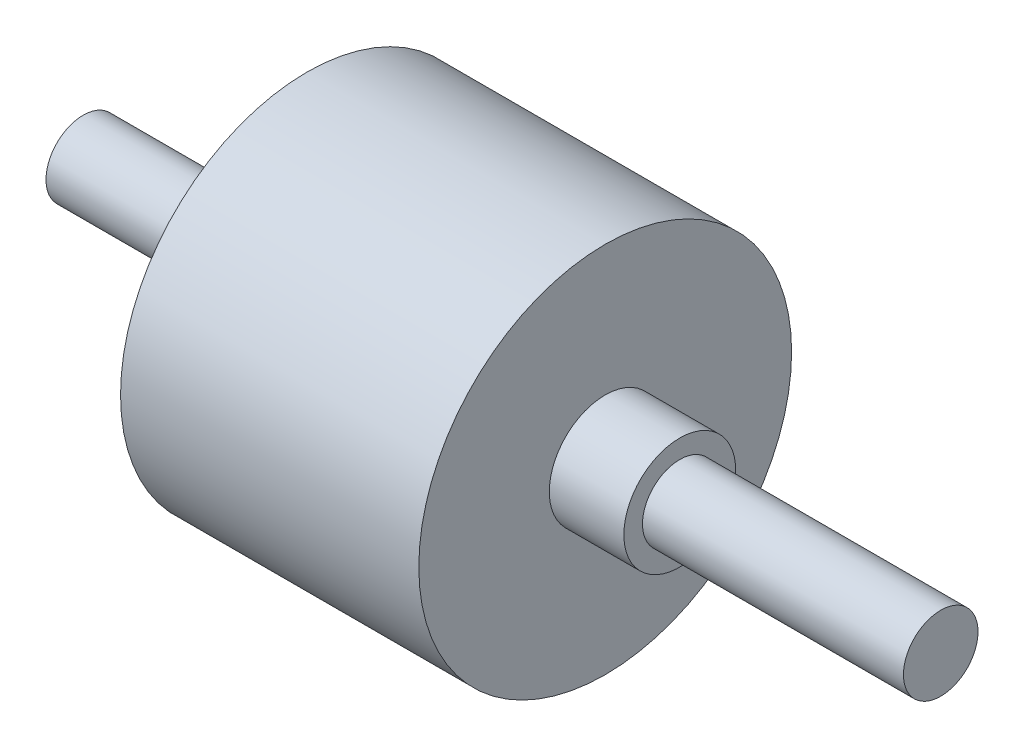
ISO-10303-21;
HEADER;
FILE_DESCRIPTION(('STEP AP214'),'2;1');
FILE_NAME('part.step','',(''),(''),'','','');
FILE_SCHEMA(('AUTOMOTIVE_DESIGN { 1 0 10303 214 1 1 1 1 }'));
ENDSEC;
DATA;
#1=APPLICATION_CONTEXT('core data for automotive mechanical design processes');
#2=APPLICATION_PROTOCOL_DEFINITION('international standard','automotive_design',2000,#1);
#3=PRODUCT_CONTEXT('',#1,'mechanical');
#4=PRODUCT('Part','Part','',(#3));
#5=PRODUCT_RELATED_PRODUCT_CATEGORY('part','',(#4));
#6=PRODUCT_DEFINITION_FORMATION('','',#4);
#7=PRODUCT_DEFINITION_CONTEXT('part definition',#1,'design');
#8=PRODUCT_DEFINITION('design','',#6,#7);
#9=PRODUCT_DEFINITION_SHAPE('','',#8);
#10=(LENGTH_UNIT() NAMED_UNIT(*) SI_UNIT(.MILLI.,.METRE.));
#11=(NAMED_UNIT(*) PLANE_ANGLE_UNIT() SI_UNIT($,.RADIAN.));
#12=(NAMED_UNIT(*) SI_UNIT($,.STERADIAN.) SOLID_ANGLE_UNIT());
#13=UNCERTAINTY_MEASURE_WITH_UNIT(LENGTH_MEASURE(1.E-05),#10,'distance_accuracy_value','');
#14=(GEOMETRIC_REPRESENTATION_CONTEXT(3) GLOBAL_UNCERTAINTY_ASSIGNED_CONTEXT((#13)) GLOBAL_UNIT_ASSIGNED_CONTEXT((#10,
#11,#12)) REPRESENTATION_CONTEXT('',''));
#15=CARTESIAN_POINT('',(0.,0.,0.));
#16=DIRECTION('',(0.,0.,1.));
#17=DIRECTION('',(1.,0.,0.));
#18=AXIS2_PLACEMENT_3D('',#15,#16,#17);
#19=CARTESIAN_POINT('',(0.,0.,0.));
#20=DIRECTION('',(-1.,0.,0.));
#21=DIRECTION('',(0.,-1.,0.));
#22=AXIS2_PLACEMENT_3D('',#19,#20,#21);
#23=PLANE('',#22);
#24=CARTESIAN_POINT('',(0.,0.,0.));
#25=DIRECTION('',(1.,0.,0.));
#26=DIRECTION('',(0.,1.,0.));
#27=AXIS2_PLACEMENT_3D('',#24,#25,#26);
#28=CIRCLE('',#27,5.);
#29=CARTESIAN_POINT('',(0.,5.,0.));
#30=VERTEX_POINT('',#29);
#31=EDGE_CURVE('E10',#30,#30,#28,.T.);
#32=ORIENTED_EDGE('',*,*,#31,.F.);
#33=EDGE_LOOP('',(#32));
#34=FACE_BOUND('',#33,.T.);
#35=ADVANCED_FACE('F39',(#34),#23,.T.);
#36=CARTESIAN_POINT('',(115.,0.,0.));
#37=DIRECTION('',(1.,0.,0.));
#38=DIRECTION('',(0.,1.,0.));
#39=AXIS2_PLACEMENT_3D('',#36,#37,#38);
#40=CYLINDRICAL_SURFACE('',#39,5.);
#41=ORIENTED_EDGE('',*,*,#31,.T.);
#42=EDGE_LOOP('',(#41));
#43=FACE_BOUND('',#42,.T.);
#44=CARTESIAN_POINT('',(30.,0.,0.));
#45=DIRECTION('',(1.,0.,0.));
#46=DIRECTION('',(0.,1.,0.));
#47=AXIS2_PLACEMENT_3D('',#44,#45,#46);
#48=CIRCLE('',#47,5.);
#49=CARTESIAN_POINT('',(30.,5.,0.));
#50=VERTEX_POINT('',#49);
#51=EDGE_CURVE('E44',#50,#50,#48,.T.);
#52=ORIENTED_EDGE('',*,*,#51,.F.);
#53=EDGE_LOOP('',(#52));
#54=FACE_BOUND('',#53,.T.);
#55=ADVANCED_FACE('F90',(#43,#54),#40,.T.);
#56=CARTESIAN_POINT('',(30.,5.,0.));
#57=DIRECTION('',(-1.,0.,0.));
#58=DIRECTION('',(0.,-1.,0.));
#59=AXIS2_PLACEMENT_3D('',#56,#57,#58);
#60=PLANE('',#59);
#61=ORIENTED_EDGE('',*,*,#51,.T.);
#62=EDGE_LOOP('',(#61));
#63=FACE_BOUND('',#62,.T.);
#64=CARTESIAN_POINT('',(30.,0.,0.));
#65=DIRECTION('',(1.,0.,0.));
#66=DIRECTION('',(0.,1.,0.));
#67=AXIS2_PLACEMENT_3D('',#64,#65,#66);
#68=CIRCLE('',#67,25.);
#69=CARTESIAN_POINT('',(30.,25.,0.));
#70=VERTEX_POINT('',#69);
#71=EDGE_CURVE('E47',#70,#70,#68,.T.);
#72=ORIENTED_EDGE('',*,*,#71,.F.);
#73=EDGE_LOOP('',(#72));
#74=FACE_BOUND('',#73,.T.);
#75=ADVANCED_FACE('F95',(#63,#74),#60,.T.);
#76=CARTESIAN_POINT('',(115.,0.,0.));
#77=DIRECTION('',(1.,0.,0.));
#78=DIRECTION('',(0.,1.,0.));
#79=AXIS2_PLACEMENT_3D('',#76,#77,#78);
#80=CYLINDRICAL_SURFACE('',#79,25.);
#81=ORIENTED_EDGE('',*,*,#71,.T.);
#82=EDGE_LOOP('',(#81));
#83=FACE_BOUND('',#82,.T.);
#84=CARTESIAN_POINT('',(70.,0.,0.));
#85=DIRECTION('',(1.,0.,0.));
#86=DIRECTION('',(0.,1.,0.));
#87=AXIS2_PLACEMENT_3D('',#84,#85,#86);
#88=CIRCLE('',#87,25.);
#89=CARTESIAN_POINT('',(70.,25.,0.));
#90=VERTEX_POINT('',#89);
#91=EDGE_CURVE('E52',#90,#90,#88,.T.);
#92=ORIENTED_EDGE('',*,*,#91,.F.);
#93=EDGE_LOOP('',(#92));
#94=FACE_BOUND('',#93,.T.);
#95=ADVANCED_FACE('F96',(#83,#94),#80,.T.);
#96=CARTESIAN_POINT('',(70.,25.,0.));
#97=DIRECTION('',(1.,0.,0.));
#98=DIRECTION('',(0.,1.,0.));
#99=AXIS2_PLACEMENT_3D('',#96,#97,#98);
#100=PLANE('',#99);
#101=ORIENTED_EDGE('',*,*,#91,.T.);
#102=EDGE_LOOP('',(#101));
#103=FACE_BOUND('',#102,.T.);
#104=CARTESIAN_POINT('',(70.,0.,0.));
#105=DIRECTION('',(1.,0.,0.));
#106=DIRECTION('',(0.,1.,0.));
#107=AXIS2_PLACEMENT_3D('',#104,#105,#106);
#108=CIRCLE('',#107,7.49999999999999);
#109=CARTESIAN_POINT('',(70.,7.49999999999999,0.));
#110=VERTEX_POINT('',#109);
#111=EDGE_CURVE('E59',#110,#110,#108,.T.);
#112=ORIENTED_EDGE('',*,*,#111,.F.);
#113=EDGE_LOOP('',(#112));
#114=FACE_BOUND('',#113,.T.);
#115=ADVANCED_FACE('F105',(#103,#114),#100,.T.);
#116=CARTESIAN_POINT('',(115.,0.,0.));
#117=DIRECTION('',(1.,0.,0.));
#118=DIRECTION('',(0.,1.,0.));
#119=AXIS2_PLACEMENT_3D('',#116,#117,#118);
#120=CYLINDRICAL_SURFACE('',#119,7.49999999999999);
#121=ORIENTED_EDGE('',*,*,#111,.T.);
#122=EDGE_LOOP('',(#121));
#123=FACE_BOUND('',#122,.T.);
#124=CARTESIAN_POINT('',(80.,0.,0.));
#125=DIRECTION('',(1.,0.,0.));
#126=DIRECTION('',(0.,1.,0.));
#127=AXIS2_PLACEMENT_3D('',#124,#125,#126);
#128=CIRCLE('',#127,7.49999999999999);
#129=CARTESIAN_POINT('',(80.,7.49999999999999,0.));
#130=VERTEX_POINT('',#129);
#131=EDGE_CURVE('E61',#130,#130,#128,.T.);
#132=ORIENTED_EDGE('',*,*,#131,.F.);
#133=EDGE_LOOP('',(#132));
#134=FACE_BOUND('',#133,.T.);
#135=ADVANCED_FACE('F81',(#123,#134),#120,.T.);
#136=CARTESIAN_POINT('',(80.,7.49999999999999,0.));
#137=DIRECTION('',(1.,0.,0.));
#138=DIRECTION('',(0.,1.,0.));
#139=AXIS2_PLACEMENT_3D('',#136,#137,#138);
#140=PLANE('',#139);
#141=ORIENTED_EDGE('',*,*,#131,.T.);
#142=EDGE_LOOP('',(#141));
#143=FACE_BOUND('',#142,.T.);
#144=CARTESIAN_POINT('',(80.,0.,0.));
#145=DIRECTION('',(1.,0.,0.));
#146=DIRECTION('',(0.,1.,0.));
#147=AXIS2_PLACEMENT_3D('',#144,#145,#146);
#148=CIRCLE('',#147,4.99999999999999);
#149=CARTESIAN_POINT('',(80.,5.,0.));
#150=VERTEX_POINT('',#149);
#151=EDGE_CURVE('E63',#150,#150,#148,.T.);
#152=ORIENTED_EDGE('',*,*,#151,.F.);
#153=EDGE_LOOP('',(#152));
#154=FACE_BOUND('',#153,.T.);
#155=ADVANCED_FACE('F75',(#143,#154),#140,.T.);
#156=CARTESIAN_POINT('',(115.,0.,0.));
#157=DIRECTION('',(1.,0.,0.));
#158=DIRECTION('',(0.,1.,0.));
#159=AXIS2_PLACEMENT_3D('',#156,#157,#158);
#160=CYLINDRICAL_SURFACE('',#159,4.99999999999999);
#161=ORIENTED_EDGE('',*,*,#151,.T.);
#162=EDGE_LOOP('',(#161));
#163=FACE_BOUND('',#162,.T.);
#164=CARTESIAN_POINT('',(115.,0.,0.));
#165=DIRECTION('',(1.,0.,0.));
#166=DIRECTION('',(0.,1.,0.));
#167=AXIS2_PLACEMENT_3D('',#164,#165,#166);
#168=CIRCLE('',#167,4.99999999999999);
#169=CARTESIAN_POINT('',(115.,5.,0.));
#170=VERTEX_POINT('',#169);
#171=EDGE_CURVE('E70',#170,#170,#168,.T.);
#172=ORIENTED_EDGE('',*,*,#171,.F.);
#173=EDGE_LOOP('',(#172));
#174=FACE_BOUND('',#173,.T.);
#175=ADVANCED_FACE('F74',(#163,#174),#160,.T.);
#176=CARTESIAN_POINT('',(115.,5.,0.));
#177=DIRECTION('',(1.,0.,0.));
#178=DIRECTION('',(0.,1.,0.));
#179=AXIS2_PLACEMENT_3D('',#176,#177,#178);
#180=PLANE('',#179);
#181=ORIENTED_EDGE('',*,*,#171,.T.);
#182=EDGE_LOOP('',(#181));
#183=FACE_BOUND('',#182,.T.);
#184=ADVANCED_FACE('F71',(#183),#180,.T.);
#185=CLOSED_SHELL('',(#35,#55,#75,#95,#115,#135,#155,#175,#184));
#186=MANIFOLD_SOLID_BREP('B2',#185);
#187=ADVANCED_BREP_SHAPE_REPRESENTATION('',(#18,#186),#14);
#188=SHAPE_DEFINITION_REPRESENTATION(#9,#187);
ENDSEC;
END-ISO-10303-21;
